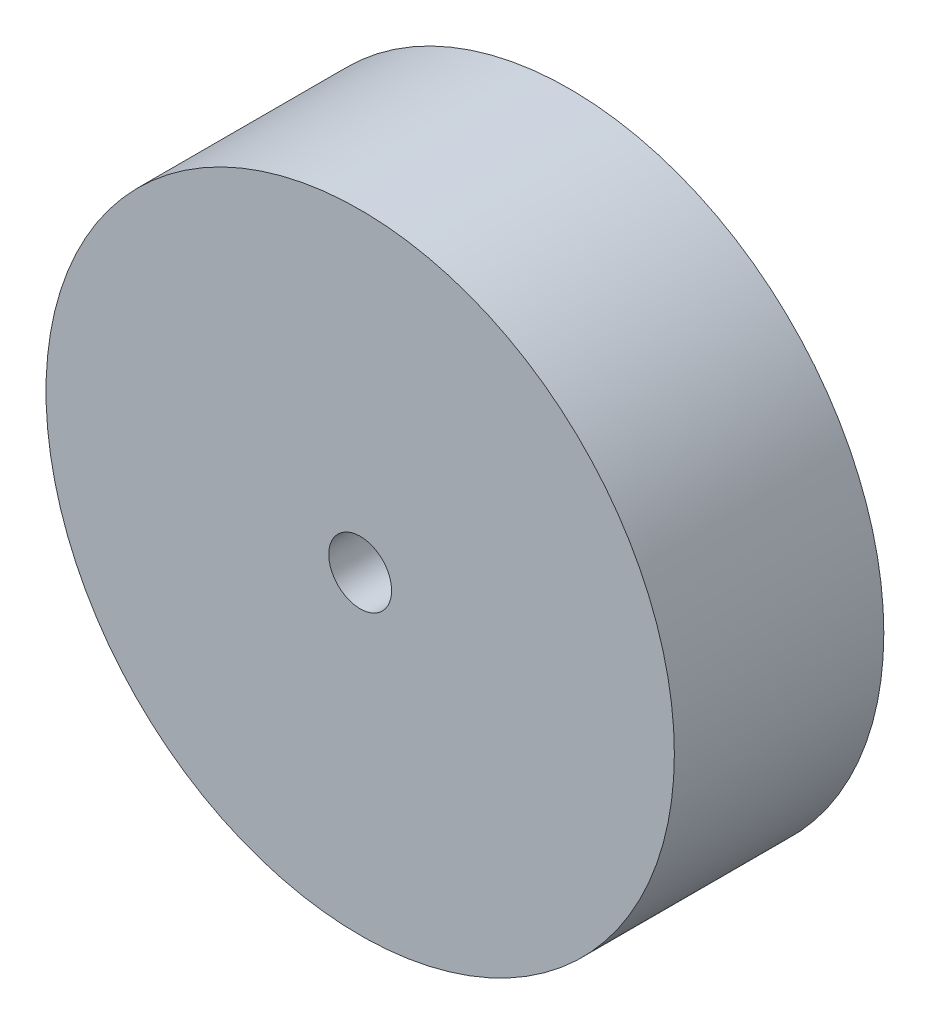
ISO-10303-21;
HEADER;
FILE_DESCRIPTION(('STEP AP214'),'2;1');
FILE_NAME('part.step','',(''),(''),'','','');
FILE_SCHEMA(('AUTOMOTIVE_DESIGN { 1 0 10303 214 1 1 1 1 }'));
ENDSEC;
DATA;
#1=APPLICATION_CONTEXT('core data for automotive mechanical design processes');
#2=APPLICATION_PROTOCOL_DEFINITION('international standard','automotive_design',2000,#1);
#3=PRODUCT_CONTEXT('',#1,'mechanical');
#4=PRODUCT('Part','Part','',(#3));
#5=PRODUCT_RELATED_PRODUCT_CATEGORY('part','',(#4));
#6=PRODUCT_DEFINITION_FORMATION('','',#4);
#7=PRODUCT_DEFINITION_CONTEXT('part definition',#1,'design');
#8=PRODUCT_DEFINITION('design','',#6,#7);
#9=PRODUCT_DEFINITION_SHAPE('','',#8);
#10=(LENGTH_UNIT() NAMED_UNIT(*) SI_UNIT(.MILLI.,.METRE.));
#11=(NAMED_UNIT(*) PLANE_ANGLE_UNIT() SI_UNIT($,.RADIAN.));
#12=(NAMED_UNIT(*) SI_UNIT($,.STERADIAN.) SOLID_ANGLE_UNIT());
#13=UNCERTAINTY_MEASURE_WITH_UNIT(LENGTH_MEASURE(1.E-05),#10,'distance_accuracy_value','');
#14=(GEOMETRIC_REPRESENTATION_CONTEXT(3) GLOBAL_UNCERTAINTY_ASSIGNED_CONTEXT((#13)) GLOBAL_UNIT_ASSIGNED_CONTEXT((#10,
#11,#12)) REPRESENTATION_CONTEXT('',''));
#15=CARTESIAN_POINT('',(0.,0.,0.));
#16=DIRECTION('',(0.,0.,1.));
#17=DIRECTION('',(1.,0.,0.));
#18=AXIS2_PLACEMENT_3D('',#15,#16,#17);
#19=CARTESIAN_POINT('',(0.,0.,10.));
#20=DIRECTION('',(0.,0.,1.));
#21=DIRECTION('',(1.,0.,0.));
#22=AXIS2_PLACEMENT_3D('',#19,#20,#21);
#23=PLANE('',#22);
#24=CARTESIAN_POINT('',(0.,0.,10.));
#25=DIRECTION('',(0.,0.,1.));
#26=DIRECTION('',(1.,0.,0.));
#27=AXIS2_PLACEMENT_3D('',#24,#25,#26);
#28=CIRCLE('',#27,15.);
#29=CARTESIAN_POINT('',(15.,0.,10.));
#30=VERTEX_POINT('',#29);
#31=EDGE_CURVE('E10',#30,#30,#28,.T.);
#32=ORIENTED_EDGE('',*,*,#31,.T.);
#33=EDGE_LOOP('',(#32));
#34=FACE_BOUND('',#33,.T.);
#35=CARTESIAN_POINT('',(0.,0.,10.));
#36=DIRECTION('',(0.,0.,1.));
#37=DIRECTION('',(1.,0.,0.));
#38=AXIS2_PLACEMENT_3D('',#35,#36,#37);
#39=CIRCLE('',#38,1.5);
#40=CARTESIAN_POINT('',(1.5,0.,10.));
#41=VERTEX_POINT('',#40);
#42=EDGE_CURVE('E56',#41,#41,#39,.T.);
#43=ORIENTED_EDGE('',*,*,#42,.F.);
#44=EDGE_LOOP('',(#43));
#45=FACE_BOUND('',#44,.T.);
#46=ADVANCED_FACE('F43',(#34,#45),#23,.T.);
#47=CARTESIAN_POINT('',(0.,0.,0.));
#48=DIRECTION('',(0.,0.,1.));
#49=DIRECTION('',(1.,0.,0.));
#50=AXIS2_PLACEMENT_3D('',#47,#48,#49);
#51=PLANE('',#50);
#52=CARTESIAN_POINT('',(0.,0.,0.));
#53=DIRECTION('',(0.,0.,1.));
#54=DIRECTION('',(1.,0.,0.));
#55=AXIS2_PLACEMENT_3D('',#52,#53,#54);
#56=CIRCLE('',#55,15.);
#57=CARTESIAN_POINT('',(15.,0.,0.));
#58=VERTEX_POINT('',#57);
#59=EDGE_CURVE('E47',#58,#58,#56,.T.);
#60=ORIENTED_EDGE('',*,*,#59,.F.);
#61=EDGE_LOOP('',(#60));
#62=FACE_BOUND('',#61,.T.);
#63=CARTESIAN_POINT('',(0.,0.,0.));
#64=DIRECTION('',(0.,0.,1.));
#65=DIRECTION('',(1.,0.,0.));
#66=AXIS2_PLACEMENT_3D('',#63,#64,#65);
#67=CIRCLE('',#66,1.5);
#68=CARTESIAN_POINT('',(1.5,0.,0.));
#69=VERTEX_POINT('',#68);
#70=EDGE_CURVE('E58',#69,#69,#67,.T.);
#71=ORIENTED_EDGE('',*,*,#70,.T.);
#72=EDGE_LOOP('',(#71));
#73=FACE_BOUND('',#72,.T.);
#74=ADVANCED_FACE('F70',(#62,#73),#51,.F.);
#75=CARTESIAN_POINT('',(0.,0.,10.));
#76=DIRECTION('',(0.,0.,-1.));
#77=DIRECTION('',(-1.,0.,0.));
#78=AXIS2_PLACEMENT_3D('',#75,#76,#77);
#79=CYLINDRICAL_SURFACE('',#78,15.);
#80=ORIENTED_EDGE('',*,*,#31,.F.);
#81=EDGE_LOOP('',(#80));
#82=FACE_BOUND('',#81,.T.);
#83=ORIENTED_EDGE('',*,*,#59,.T.);
#84=EDGE_LOOP('',(#83));
#85=FACE_BOUND('',#84,.T.);
#86=ADVANCED_FACE('F45',(#82,#85),#79,.T.);
#87=CARTESIAN_POINT('',(0.,0.,10.));
#88=DIRECTION('',(0.,0.,-1.));
#89=DIRECTION('',(-1.,0.,0.));
#90=AXIS2_PLACEMENT_3D('',#87,#88,#89);
#91=CYLINDRICAL_SURFACE('',#90,1.5);
#92=ORIENTED_EDGE('',*,*,#42,.T.);
#93=EDGE_LOOP('',(#92));
#94=FACE_BOUND('',#93,.T.);
#95=ORIENTED_EDGE('',*,*,#70,.F.);
#96=EDGE_LOOP('',(#95));
#97=FACE_BOUND('',#96,.T.);
#98=ADVANCED_FACE('F66',(#94,#97),#91,.F.);
#99=CLOSED_SHELL('',(#46,#74,#86,#98));
#100=MANIFOLD_SOLID_BREP('B2',#99);
#101=ADVANCED_BREP_SHAPE_REPRESENTATION('',(#18,#100),#14);
#102=SHAPE_DEFINITION_REPRESENTATION(#9,#101);
ENDSEC;
END-ISO-10303-21;
